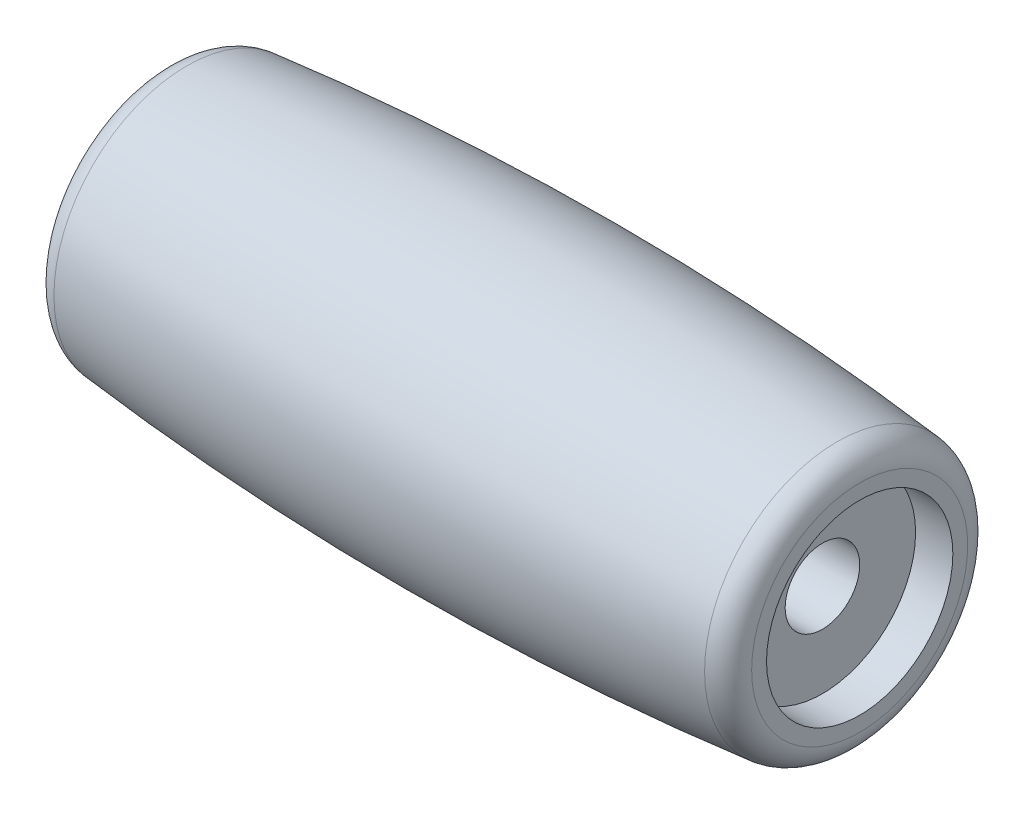
ISO-10303-21;
HEADER;
FILE_DESCRIPTION(('STEP AP214'),'2;1');
FILE_NAME('part.step','',(''),(''),'','','');
FILE_SCHEMA(('AUTOMOTIVE_DESIGN { 1 0 10303 214 1 1 1 1 }'));
ENDSEC;
DATA;
#1=APPLICATION_CONTEXT('core data for automotive mechanical design processes');
#2=APPLICATION_PROTOCOL_DEFINITION('international standard','automotive_design',2000,#1);
#3=PRODUCT_CONTEXT('',#1,'mechanical');
#4=PRODUCT('Part','Part','',(#3));
#5=PRODUCT_RELATED_PRODUCT_CATEGORY('part','',(#4));
#6=PRODUCT_DEFINITION_FORMATION('','',#4);
#7=PRODUCT_DEFINITION_CONTEXT('part definition',#1,'design');
#8=PRODUCT_DEFINITION('design','',#6,#7);
#9=PRODUCT_DEFINITION_SHAPE('','',#8);
#10=(LENGTH_UNIT() NAMED_UNIT(*) SI_UNIT(.MILLI.,.METRE.));
#11=(NAMED_UNIT(*) PLANE_ANGLE_UNIT() SI_UNIT($,.RADIAN.));
#12=(NAMED_UNIT(*) SI_UNIT($,.STERADIAN.) SOLID_ANGLE_UNIT());
#13=UNCERTAINTY_MEASURE_WITH_UNIT(LENGTH_MEASURE(1.E-05),#10,'distance_accuracy_value','');
#14=(GEOMETRIC_REPRESENTATION_CONTEXT(3) GLOBAL_UNCERTAINTY_ASSIGNED_CONTEXT((#13)) GLOBAL_UNIT_ASSIGNED_CONTEXT((#10,
#11,#12)) REPRESENTATION_CONTEXT('',''));
#15=CARTESIAN_POINT('',(0.,0.,0.));
#16=DIRECTION('',(0.,0.,1.));
#17=DIRECTION('',(1.,0.,0.));
#18=AXIS2_PLACEMENT_3D('',#15,#16,#17);
#19=CARTESIAN_POINT('',(0.00630985060381323,0.,0.));
#20=DIRECTION('',(-1.,0.,0.));
#21=DIRECTION('',(0.,0.,1.));
#22=AXIS2_PLACEMENT_3D('',#19,#20,#21);
#23=DEGENERATE_TOROIDAL_SURFACE('',#22,125.165078447068,131.165078606114,.F.);
#24=CARTESIAN_POINT('',(13.0995209622022,0.,0.));
#25=DIRECTION('',(-1.,0.,0.));
#26=DIRECTION('',(0.,0.,1.));
#27=AXIS2_PLACEMENT_3D('',#24,#25,#26);
#28=CIRCLE('',#27,5.34486626418892);
#29=CARTESIAN_POINT('',(13.0995209622022,0.,5.34486626418892));
#30=VERTEX_POINT('',#29);
#31=EDGE_CURVE('E71',#30,#30,#28,.T.);
#32=ORIENTED_EDGE('',*,*,#31,.T.);
#33=EDGE_LOOP('',(#32));
#34=FACE_BOUND('',#33,.T.);
#35=CARTESIAN_POINT('',(-13.1002253927989,0.,0.));
#36=DIRECTION('',(-1.,0.,0.));
#37=DIRECTION('',(0.,0.,1.));
#38=AXIS2_PLACEMENT_3D('',#35,#36,#37);
#39=CIRCLE('',#38,5.34352885398959);
#40=CARTESIAN_POINT('',(-13.1002253927989,0.,5.34352885398959));
#41=VERTEX_POINT('',#40);
#42=EDGE_CURVE('E10',#41,#41,#39,.T.);
#43=ORIENTED_EDGE('',*,*,#42,.F.);
#44=EDGE_LOOP('',(#43));
#45=FACE_BOUND('',#44,.T.);
#46=ADVANCED_FACE('F37',(#34,#45),#23,.F.);
#47=CARTESIAN_POINT('',(-13.0003014238379,0.,0.));
#48=DIRECTION('',(-1.,0.,0.));
#49=DIRECTION('',(0.,0.,1.));
#50=AXIS2_PLACEMENT_3D('',#47,#48,#49);
#51=TOROIDAL_SURFACE('',#50,4.34853377841029,0.999999999999991);
#52=CARTESIAN_POINT('',(-14.0003014238379,0.,0.));
#53=DIRECTION('',(-1.,0.,0.));
#54=DIRECTION('',(0.,0.,1.));
#55=AXIS2_PLACEMENT_3D('',#52,#53,#54);
#56=CIRCLE('',#55,4.34853377841029);
#57=CARTESIAN_POINT('',(-14.0003014238379,0.,4.34853377841029));
#58=VERTEX_POINT('',#57);
#59=EDGE_CURVE('E43',#58,#58,#56,.T.);
#60=ORIENTED_EDGE('',*,*,#59,.F.);
#61=EDGE_LOOP('',(#60));
#62=FACE_BOUND('',#61,.T.);
#63=ORIENTED_EDGE('',*,*,#42,.T.);
#64=EDGE_LOOP('',(#63));
#65=FACE_BOUND('',#64,.T.);
#66=ADVANCED_FACE('F89',(#62,#65),#51,.T.);
#67=CARTESIAN_POINT('',(-14.0003014238379,0.,0.));
#68=DIRECTION('',(1.,0.,0.));
#69=DIRECTION('',(0.,0.,-1.));
#70=AXIS2_PLACEMENT_3D('',#67,#68,#69);
#71=PLANE('',#70);
#72=CARTESIAN_POINT('',(-14.0003014238379,0.,0.));
#73=DIRECTION('',(-1.,0.,0.));
#74=DIRECTION('',(0.,0.,1.));
#75=AXIS2_PLACEMENT_3D('',#72,#73,#74);
#76=CIRCLE('',#75,3.75);
#77=CARTESIAN_POINT('',(-14.0003014238379,0.,3.75));
#78=VERTEX_POINT('',#77);
#79=EDGE_CURVE('E47',#78,#78,#76,.T.);
#80=ORIENTED_EDGE('',*,*,#79,.F.);
#81=EDGE_LOOP('',(#80));
#82=FACE_BOUND('',#81,.T.);
#83=ORIENTED_EDGE('',*,*,#59,.T.);
#84=EDGE_LOOP('',(#83));
#85=FACE_BOUND('',#84,.T.);
#86=ADVANCED_FACE('F93',(#82,#85),#71,.F.);
#87=CARTESIAN_POINT('',(-15.7237766047005,0.,0.));
#88=DIRECTION('',(-1.,0.,0.));
#89=DIRECTION('',(0.,0.,1.));
#90=AXIS2_PLACEMENT_3D('',#87,#88,#89);
#91=CYLINDRICAL_SURFACE('',#90,3.75);
#92=ORIENTED_EDGE('',*,*,#79,.T.);
#93=EDGE_LOOP('',(#92));
#94=FACE_BOUND('',#93,.T.);
#95=CARTESIAN_POINT('',(-12.5003014238379,0.,0.));
#96=DIRECTION('',(-1.,0.,0.));
#97=DIRECTION('',(0.,0.,1.));
#98=AXIS2_PLACEMENT_3D('',#95,#96,#97);
#99=CIRCLE('',#98,3.75);
#100=CARTESIAN_POINT('',(-12.5003014238379,0.,3.75));
#101=VERTEX_POINT('',#100);
#102=EDGE_CURVE('E51',#101,#101,#99,.T.);
#103=ORIENTED_EDGE('',*,*,#102,.F.);
#104=EDGE_LOOP('',(#103));
#105=FACE_BOUND('',#104,.T.);
#106=ADVANCED_FACE('F98',(#94,#105),#91,.F.);
#107=CARTESIAN_POINT('',(-12.5003014238379,0.,0.));
#108=DIRECTION('',(1.,0.,0.));
#109=DIRECTION('',(0.,0.,-1.));
#110=AXIS2_PLACEMENT_3D('',#107,#108,#109);
#111=PLANE('',#110);
#112=CARTESIAN_POINT('',(-12.5003014238379,0.,0.));
#113=DIRECTION('',(-1.,0.,0.));
#114=DIRECTION('',(0.,0.,1.));
#115=AXIS2_PLACEMENT_3D('',#112,#113,#114);
#116=CIRCLE('',#115,1.5);
#117=CARTESIAN_POINT('',(-12.5003014238379,0.,1.5));
#118=VERTEX_POINT('',#117);
#119=EDGE_CURVE('E56',#118,#118,#116,.T.);
#120=ORIENTED_EDGE('',*,*,#119,.F.);
#121=EDGE_LOOP('',(#120));
#122=FACE_BOUND('',#121,.T.);
#123=ORIENTED_EDGE('',*,*,#102,.T.);
#124=EDGE_LOOP('',(#123));
#125=FACE_BOUND('',#124,.T.);
#126=ADVANCED_FACE('F104',(#122,#125),#111,.F.);
#127=CARTESIAN_POINT('',(-12.5003014238379,0.,0.));
#128=DIRECTION('',(1.,0.,0.));
#129=DIRECTION('',(0.,0.,-1.));
#130=AXIS2_PLACEMENT_3D('',#127,#128,#129);
#131=CONICAL_SURFACE('',#130,1.5,5.06942225482718E-05);
#132=CARTESIAN_POINT('',(12.5001492769214,0.,0.));
#133=DIRECTION('',(-1.,0.,0.));
#134=DIRECTION('',(0.,0.,1.));
#135=AXIS2_PLACEMENT_3D('',#132,#133,#134);
#136=CIRCLE('',#135,1.50126737841272);
#137=CARTESIAN_POINT('',(12.5001492769214,0.,1.50126737841272));
#138=VERTEX_POINT('',#137);
#139=EDGE_CURVE('E59',#138,#138,#136,.T.);
#140=ORIENTED_EDGE('',*,*,#139,.F.);
#141=EDGE_LOOP('',(#140));
#142=FACE_BOUND('',#141,.T.);
#143=ORIENTED_EDGE('',*,*,#119,.T.);
#144=EDGE_LOOP('',(#143));
#145=FACE_BOUND('',#144,.T.);
#146=ADVANCED_FACE('F108',(#142,#145),#131,.F.);
#147=CARTESIAN_POINT('',(12.5001492769214,0.,0.));
#148=DIRECTION('',(-1.,0.,0.));
#149=DIRECTION('',(0.,0.,1.));
#150=AXIS2_PLACEMENT_3D('',#147,#148,#149);
#151=CONICAL_SURFACE('',#150,1.50126737841272,1.5706949383498);
#152=CARTESIAN_POINT('',(12.4999211529203,0.,0.));
#153=DIRECTION('',(-1.,0.,0.));
#154=DIRECTION('',(0.,0.,1.));
#155=AXIS2_PLACEMENT_3D('',#152,#153,#154);
#156=CIRCLE('',#155,3.75126736684815);
#157=CARTESIAN_POINT('',(12.4999211529203,0.,3.75126736684815));
#158=VERTEX_POINT('',#157);
#159=EDGE_CURVE('E62',#158,#158,#156,.T.);
#160=ORIENTED_EDGE('',*,*,#159,.F.);
#161=EDGE_LOOP('',(#160));
#162=FACE_BOUND('',#161,.T.);
#163=ORIENTED_EDGE('',*,*,#139,.T.);
#164=EDGE_LOOP('',(#163));
#165=FACE_BOUND('',#164,.T.);
#166=ADVANCED_FACE('F112',(#162,#165),#151,.T.);
#167=CARTESIAN_POINT('',(12.4999211529203,0.,0.));
#168=DIRECTION('',(1.,0.,0.));
#169=DIRECTION('',(0.,0.,-1.));
#170=AXIS2_PLACEMENT_3D('',#167,#168,#169);
#171=CONICAL_SURFACE('',#170,3.75126736684815,0.000101388445096252);
#172=CARTESIAN_POINT('',(13.9996985761621,0.,0.));
#173=DIRECTION('',(-1.,0.,0.));
#174=DIRECTION('',(0.,0.,1.));
#175=AXIS2_PLACEMENT_3D('',#172,#173,#174);
#176=CIRCLE('',#175,3.7514194269496);
#177=CARTESIAN_POINT('',(13.9996985761621,0.,3.7514194269496));
#178=VERTEX_POINT('',#177);
#179=EDGE_CURVE('E65',#178,#178,#176,.T.);
#180=ORIENTED_EDGE('',*,*,#179,.F.);
#181=EDGE_LOOP('',(#180));
#182=FACE_BOUND('',#181,.T.);
#183=ORIENTED_EDGE('',*,*,#159,.T.);
#184=EDGE_LOOP('',(#183));
#185=FACE_BOUND('',#184,.T.);
#186=ADVANCED_FACE('F85',(#182,#185),#171,.F.);
#187=CARTESIAN_POINT('',(13.9996985761621,0.,0.));
#188=DIRECTION('',(1.,0.,0.));
#189=DIRECTION('',(0.,0.,-1.));
#190=AXIS2_PLACEMENT_3D('',#187,#188,#189);
#191=PLANE('',#190);
#192=ORIENTED_EDGE('',*,*,#179,.T.);
#193=EDGE_LOOP('',(#192));
#194=FACE_BOUND('',#193,.T.);
#195=CARTESIAN_POINT('',(13.9996985761621,0.,0.));
#196=DIRECTION('',(-1.,0.,0.));
#197=DIRECTION('',(0.,0.,1.));
#198=AXIS2_PLACEMENT_3D('',#195,#196,#197);
#199=CIRCLE('',#198,4.34986099222032);
#200=CARTESIAN_POINT('',(13.9996985761621,0.,4.34986099222032));
#201=VERTEX_POINT('',#200);
#202=EDGE_CURVE('E68',#201,#201,#199,.T.);
#203=ORIENTED_EDGE('',*,*,#202,.F.);
#204=EDGE_LOOP('',(#203));
#205=FACE_BOUND('',#204,.T.);
#206=ADVANCED_FACE('F79',(#194,#205),#191,.T.);
#207=CARTESIAN_POINT('',(12.9996985761621,0.,0.));
#208=DIRECTION('',(-1.,0.,0.));
#209=DIRECTION('',(0.,0.,1.));
#210=AXIS2_PLACEMENT_3D('',#207,#208,#209);
#211=TOROIDAL_SURFACE('',#210,4.34986099222032,0.999999999999998);
#212=ORIENTED_EDGE('',*,*,#202,.T.);
#213=EDGE_LOOP('',(#212));
#214=FACE_BOUND('',#213,.T.);
#215=ORIENTED_EDGE('',*,*,#31,.F.);
#216=EDGE_LOOP('',(#215));
#217=FACE_BOUND('',#216,.T.);
#218=ADVANCED_FACE('F77',(#214,#217),#211,.T.);
#219=CLOSED_SHELL('',(#46,#66,#86,#106,#126,#146,#166,#186,#206,#218));
#220=MANIFOLD_SOLID_BREP('B2',#219);
#221=ADVANCED_BREP_SHAPE_REPRESENTATION('',(#18,#220),#14);
#222=SHAPE_DEFINITION_REPRESENTATION(#9,#221);
ENDSEC;
END-ISO-10303-21;
